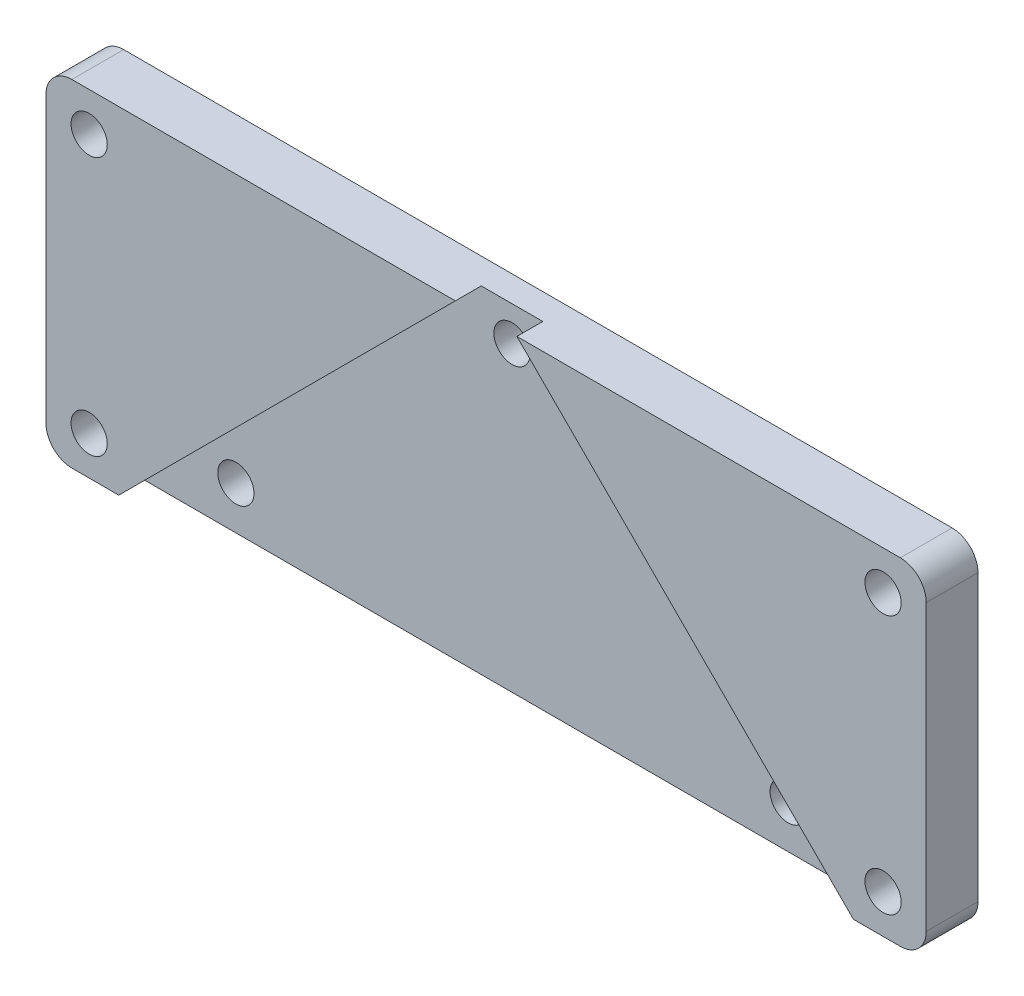
ISO-10303-21;
HEADER;
FILE_DESCRIPTION(('STEP AP214'),'2;1');
FILE_NAME('part.step','',(''),(''),'','','');
FILE_SCHEMA(('AUTOMOTIVE_DESIGN { 1 0 10303 214 1 1 1 1 }'));
ENDSEC;
DATA;
#1=APPLICATION_CONTEXT('core data for automotive mechanical design processes');
#2=APPLICATION_PROTOCOL_DEFINITION('international standard','automotive_design',2000,#1);
#3=PRODUCT_CONTEXT('',#1,'mechanical');
#4=PRODUCT('Part','Part','',(#3));
#5=PRODUCT_RELATED_PRODUCT_CATEGORY('part','',(#4));
#6=PRODUCT_DEFINITION_FORMATION('','',#4);
#7=PRODUCT_DEFINITION_CONTEXT('part definition',#1,'design');
#8=PRODUCT_DEFINITION('design','',#6,#7);
#9=PRODUCT_DEFINITION_SHAPE('','',#8);
#10=(LENGTH_UNIT() NAMED_UNIT(*) SI_UNIT(.MILLI.,.METRE.));
#11=(NAMED_UNIT(*) PLANE_ANGLE_UNIT() SI_UNIT($,.RADIAN.));
#12=(NAMED_UNIT(*) SI_UNIT($,.STERADIAN.) SOLID_ANGLE_UNIT());
#13=UNCERTAINTY_MEASURE_WITH_UNIT(LENGTH_MEASURE(1.E-05),#10,'distance_accuracy_value','');
#14=(GEOMETRIC_REPRESENTATION_CONTEXT(3) GLOBAL_UNCERTAINTY_ASSIGNED_CONTEXT((#13)) GLOBAL_UNIT_ASSIGNED_CONTEXT((#10,
#11,#12)) REPRESENTATION_CONTEXT('',''));
#15=CARTESIAN_POINT('',(0.,0.,0.));
#16=DIRECTION('',(0.,0.,1.));
#17=DIRECTION('',(1.,0.,0.));
#18=AXIS2_PLACEMENT_3D('',#15,#16,#17);
#19=CARTESIAN_POINT('',(0.,0.,6.));
#20=DIRECTION('',(0.,0.,1.));
#21=DIRECTION('',(1.,0.,0.));
#22=AXIS2_PLACEMENT_3D('',#19,#20,#21);
#23=PLANE('',#22);
#24=CARTESIAN_POINT('',(46.,29.5,6.));
#25=DIRECTION('',(0.,0.,1.));
#26=DIRECTION('',(1.,0.,0.));
#27=AXIS2_PLACEMENT_3D('',#24,#25,#26);
#28=CIRCLE('',#27,2.10000000000001);
#29=CARTESIAN_POINT('',(48.1,29.5,6.));
#30=VERTEX_POINT('',#29);
#31=EDGE_CURVE('E183',#30,#30,#28,.T.);
#32=ORIENTED_EDGE('',*,*,#31,.F.);
#33=EDGE_LOOP('',(#32));
#34=FACE_BOUND('',#33,.T.);
#35=CARTESIAN_POINT('',(46.,-0.500000000000003,6.));
#36=DIRECTION('',(0.,0.,1.));
#37=DIRECTION('',(1.,0.,0.));
#38=AXIS2_PLACEMENT_3D('',#35,#36,#37);
#39=CIRCLE('',#38,2.1);
#40=CARTESIAN_POINT('',(48.1,-0.500000000000003,6.));
#41=VERTEX_POINT('',#40);
#42=EDGE_CURVE('E159',#41,#41,#39,.T.);
#43=ORIENTED_EDGE('',*,*,#42,.F.);
#44=EDGE_LOOP('',(#43));
#45=FACE_BOUND('',#44,.T.);
#46=DIRECTION('',(0.,1.,0.));
#47=VECTOR('',#46,1.);
#48=CARTESIAN_POINT('',(51.,-5.,6.));
#49=LINE('',#48,#47);
#50=CARTESIAN_POINT('',(51.,-1.99999999999999,6.));
#51=VERTEX_POINT('',#50);
#52=CARTESIAN_POINT('',(51.,31.,6.));
#53=VERTEX_POINT('',#52);
#54=EDGE_CURVE('E192',#51,#53,#49,.T.);
#55=ORIENTED_EDGE('',*,*,#54,.T.);
#56=CARTESIAN_POINT('',(48.,31.,6.00000000000001));
#57=DIRECTION('',(0.,0.,1.));
#58=DIRECTION('',(1.,0.,0.));
#59=AXIS2_PLACEMENT_3D('',#56,#57,#58);
#60=CIRCLE('',#59,3.);
#61=CARTESIAN_POINT('',(48.,34.,6.));
#62=VERTEX_POINT('',#61);
#63=EDGE_CURVE('E12',#53,#62,#60,.T.);
#64=ORIENTED_EDGE('',*,*,#63,.T.);
#65=DIRECTION('',(-1.,0.,0.));
#66=VECTOR('',#65,1.);
#67=CARTESIAN_POINT('',(-3.42499999999999,34.,6.));
#68=LINE('',#67,#66);
#69=CARTESIAN_POINT('',(3.56642135623733,34.,6.));
#70=VERTEX_POINT('',#69);
#71=EDGE_CURVE('E209',#62,#70,#68,.T.);
#72=ORIENTED_EDGE('',*,*,#71,.T.);
#73=DIRECTION('',(0.707106781186565,-0.70710678118653,0.));
#74=VECTOR('',#73,1.);
#75=CARTESIAN_POINT('',(18.7832106781176,18.7832106781185,6.));
#76=LINE('',#75,#74);
#77=CARTESIAN_POINT('',(42.5664213562373,-4.99999999999999,6.));
#78=VERTEX_POINT('',#77);
#79=EDGE_CURVE('E286',#70,#78,#76,.T.);
#80=ORIENTED_EDGE('',*,*,#79,.T.);
#81=DIRECTION('',(1.,0.,0.));
#82=VECTOR('',#81,1.);
#83=CARTESIAN_POINT('',(-42.425,-5.,6.));
#84=LINE('',#83,#82);
#85=CARTESIAN_POINT('',(48.,-4.99999999999999,6.));
#86=VERTEX_POINT('',#85);
#87=EDGE_CURVE('E208',#78,#86,#84,.T.);
#88=ORIENTED_EDGE('',*,*,#87,.T.);
#89=CARTESIAN_POINT('',(48.,-1.99999999999999,6.));
#90=DIRECTION('',(0.,0.,1.));
#91=DIRECTION('',(1.,0.,0.));
#92=AXIS2_PLACEMENT_3D('',#89,#90,#91);
#93=CIRCLE('',#92,3.);
#94=EDGE_CURVE('E45',#86,#51,#93,.T.);
#95=ORIENTED_EDGE('',*,*,#94,.T.);
#96=EDGE_LOOP('',(#55,#64,#72,#80,#88,#95));
#97=FACE_BOUND('',#96,.T.);
#98=ADVANCED_FACE('F37',(#34,#45,#97),#23,.T.);
#99=CARTESIAN_POINT('',(-42.425,-5.,6.));
#100=DIRECTION('',(0.,1.,0.));
#101=DIRECTION('',(-1.,0.,0.));
#102=AXIS2_PLACEMENT_3D('',#99,#100,#101);
#103=PLANE('',#102);
#104=CARTESIAN_POINT('',(-48.,-5.,6.));
#105=VERTEX_POINT('',#104);
#106=CARTESIAN_POINT('',(-42.5664213562373,-5.,6.));
#107=VERTEX_POINT('',#106);
#108=EDGE_CURVE('E205',#105,#107,#84,.T.);
#109=ORIENTED_EDGE('',*,*,#108,.F.);
#110=DIRECTION('',(0.,0.,1.));
#111=VECTOR('',#110,1.);
#112=CARTESIAN_POINT('',(-48.,-5.,0.));
#113=LINE('',#112,#111);
#114=CARTESIAN_POINT('',(-48.,-5.,0.));
#115=VERTEX_POINT('',#114);
#116=EDGE_CURVE('E241',#105,#115,#113,.F.);
#117=ORIENTED_EDGE('',*,*,#116,.T.);
#118=DIRECTION('',(1.,0.,0.));
#119=VECTOR('',#118,1.);
#120=CARTESIAN_POINT('',(-42.425,-5.,0.));
#121=LINE('',#120,#119);
#122=CARTESIAN_POINT('',(48.,-4.99999999999999,0.));
#123=VERTEX_POINT('',#122);
#124=EDGE_CURVE('E204',#115,#123,#121,.T.);
#125=ORIENTED_EDGE('',*,*,#124,.T.);
#126=DIRECTION('',(0.,0.,1.));
#127=VECTOR('',#126,1.);
#128=CARTESIAN_POINT('',(48.,-4.99999999999999,6.));
#129=LINE('',#128,#127);
#130=EDGE_CURVE('E238',#123,#86,#129,.T.);
#131=ORIENTED_EDGE('',*,*,#130,.T.);
#132=ORIENTED_EDGE('',*,*,#87,.F.);
#133=DIRECTION('',(0.,0.,1.));
#134=VECTOR('',#133,1.);
#135=CARTESIAN_POINT('',(42.5664213562373,-4.99999999999999,-93.6408079221177));
#136=LINE('',#135,#134);
#137=CARTESIAN_POINT('',(42.5664213562373,-4.99999999999999,3.));
#138=VERTEX_POINT('',#137);
#139=EDGE_CURVE('E146',#138,#78,#136,.T.);
#140=ORIENTED_EDGE('',*,*,#139,.F.);
#141=DIRECTION('',(-1.,0.,0.));
#142=VECTOR('',#141,1.);
#143=CARTESIAN_POINT('',(0.,-4.99999999999999,3.));
#144=LINE('',#143,#142);
#145=CARTESIAN_POINT('',(-42.5664213562373,-5.,3.));
#146=VERTEX_POINT('',#145);
#147=EDGE_CURVE('E130',#138,#146,#144,.T.);
#148=ORIENTED_EDGE('',*,*,#147,.T.);
#149=DIRECTION('',(0.,0.,1.));
#150=VECTOR('',#149,1.);
#151=CARTESIAN_POINT('',(-42.5664213562373,-5.,-93.6408079221177));
#152=LINE('',#151,#150);
#153=EDGE_CURVE('E139',#146,#107,#152,.T.);
#154=ORIENTED_EDGE('',*,*,#153,.T.);
#155=EDGE_LOOP('',(#109,#117,#125,#131,#132,#140,#148,#154));
#156=FACE_BOUND('',#155,.T.);
#157=ADVANCED_FACE('F148',(#156),#103,.F.);
#158=CARTESIAN_POINT('',(-3.42499999999999,34.,6.));
#159=DIRECTION('',(0.,-1.,0.));
#160=DIRECTION('',(0.,0.,-1.));
#161=AXIS2_PLACEMENT_3D('',#158,#159,#160);
#162=PLANE('',#161);
#163=DIRECTION('',(-1.,0.,0.));
#164=VECTOR('',#163,1.);
#165=CARTESIAN_POINT('',(-3.42499999999999,34.,0.));
#166=LINE('',#165,#164);
#167=CARTESIAN_POINT('',(48.,34.,0.));
#168=VERTEX_POINT('',#167);
#169=CARTESIAN_POINT('',(-48.,34.,0.));
#170=VERTEX_POINT('',#169);
#171=EDGE_CURVE('E214',#168,#170,#166,.T.);
#172=ORIENTED_EDGE('',*,*,#171,.T.);
#173=DIRECTION('',(0.,0.,1.));
#174=VECTOR('',#173,1.);
#175=CARTESIAN_POINT('',(-48.,34.,6.));
#176=LINE('',#175,#174);
#177=CARTESIAN_POINT('',(-48.,34.,6.));
#178=VERTEX_POINT('',#177);
#179=EDGE_CURVE('E218',#170,#178,#176,.T.);
#180=ORIENTED_EDGE('',*,*,#179,.T.);
#181=CARTESIAN_POINT('',(-3.5664213562373,34.,6.));
#182=VERTEX_POINT('',#181);
#183=EDGE_CURVE('E207',#182,#178,#68,.T.);
#184=ORIENTED_EDGE('',*,*,#183,.F.);
#185=DIRECTION('',(0.,0.,1.));
#186=VECTOR('',#185,1.);
#187=CARTESIAN_POINT('',(-3.5664213562373,34.,-93.6408079221177));
#188=LINE('',#187,#186);
#189=CARTESIAN_POINT('',(-3.5664213562373,34.,3.));
#190=VERTEX_POINT('',#189);
#191=EDGE_CURVE('E145',#190,#182,#188,.T.);
#192=ORIENTED_EDGE('',*,*,#191,.F.);
#193=DIRECTION('',(1.,0.,0.));
#194=VECTOR('',#193,1.);
#195=CARTESIAN_POINT('',(0.,34.,3.));
#196=LINE('',#195,#194);
#197=CARTESIAN_POINT('',(3.56642135623732,34.,3.));
#198=VERTEX_POINT('',#197);
#199=EDGE_CURVE('E133',#190,#198,#196,.T.);
#200=ORIENTED_EDGE('',*,*,#199,.T.);
#201=DIRECTION('',(0.,0.,1.));
#202=VECTOR('',#201,1.);
#203=CARTESIAN_POINT('',(3.56642135623733,34.,-93.6408079221177));
#204=LINE('',#203,#202);
#205=EDGE_CURVE('E258',#198,#70,#204,.T.);
#206=ORIENTED_EDGE('',*,*,#205,.T.);
#207=ORIENTED_EDGE('',*,*,#71,.F.);
#208=DIRECTION('',(0.,0.,1.));
#209=VECTOR('',#208,1.);
#210=CARTESIAN_POINT('',(48.,34.,0.));
#211=LINE('',#210,#209);
#212=EDGE_CURVE('E211',#62,#168,#211,.F.);
#213=ORIENTED_EDGE('',*,*,#212,.T.);
#214=EDGE_LOOP('',(#172,#180,#184,#192,#200,#206,#207,#213));
#215=FACE_BOUND('',#214,.T.);
#216=ADVANCED_FACE('F256',(#215),#162,.F.);
#217=CARTESIAN_POINT('',(0.,30.,6.));
#218=DIRECTION('',(0.,0.,-1.));
#219=DIRECTION('',(-1.,0.,0.));
#220=AXIS2_PLACEMENT_3D('',#217,#218,#219);
#221=CYLINDRICAL_SURFACE('',#220,2.1);
#222=CARTESIAN_POINT('',(0.,30.,0.));
#223=DIRECTION('',(0.,0.,1.));
#224=DIRECTION('',(1.,0.,0.));
#225=AXIS2_PLACEMENT_3D('',#222,#223,#224);
#226=CIRCLE('',#225,2.1);
#227=CARTESIAN_POINT('',(2.1,30.,0.));
#228=VERTEX_POINT('',#227);
#229=EDGE_CURVE('E201',#228,#228,#226,.T.);
#230=ORIENTED_EDGE('',*,*,#229,.F.);
#231=EDGE_LOOP('',(#230));
#232=FACE_BOUND('',#231,.T.);
#233=CARTESIAN_POINT('',(0.,30.,3.));
#234=DIRECTION('',(0.,0.,1.));
#235=DIRECTION('',(1.,0.,0.));
#236=AXIS2_PLACEMENT_3D('',#233,#234,#235);
#237=CIRCLE('',#236,2.1);
#238=CARTESIAN_POINT('',(2.1,30.,3.));
#239=VERTEX_POINT('',#238);
#240=EDGE_CURVE('E294',#239,#239,#237,.T.);
#241=ORIENTED_EDGE('',*,*,#240,.T.);
#242=EDGE_LOOP('',(#241));
#243=FACE_BOUND('',#242,.T.);
#244=ADVANCED_FACE('F316',(#232,#243),#221,.F.);
#245=CARTESIAN_POINT('',(-32.,0.,6.));
#246=DIRECTION('',(0.,0.,-1.));
#247=DIRECTION('',(-1.,0.,0.));
#248=AXIS2_PLACEMENT_3D('',#245,#246,#247);
#249=CYLINDRICAL_SURFACE('',#248,2.1);
#250=CARTESIAN_POINT('',(-32.,0.,0.));
#251=DIRECTION('',(0.,0.,1.));
#252=DIRECTION('',(1.,0.,0.));
#253=AXIS2_PLACEMENT_3D('',#250,#251,#252);
#254=CIRCLE('',#253,2.1);
#255=CARTESIAN_POINT('',(-29.9,0.,0.));
#256=VERTEX_POINT('',#255);
#257=EDGE_CURVE('E198',#256,#256,#254,.T.);
#258=ORIENTED_EDGE('',*,*,#257,.F.);
#259=EDGE_LOOP('',(#258));
#260=FACE_BOUND('',#259,.T.);
#261=CARTESIAN_POINT('',(-32.,0.,3.));
#262=DIRECTION('',(0.,0.,1.));
#263=DIRECTION('',(1.,0.,0.));
#264=AXIS2_PLACEMENT_3D('',#261,#262,#263);
#265=CIRCLE('',#264,2.1);
#266=CARTESIAN_POINT('',(-29.9,0.,3.));
#267=VERTEX_POINT('',#266);
#268=EDGE_CURVE('E153',#267,#267,#265,.T.);
#269=ORIENTED_EDGE('',*,*,#268,.T.);
#270=EDGE_LOOP('',(#269));
#271=FACE_BOUND('',#270,.T.);
#272=ADVANCED_FACE('F299',(#260,#271),#249,.F.);
#273=CARTESIAN_POINT('',(32.,0.,6.));
#274=DIRECTION('',(0.,0.,-1.));
#275=DIRECTION('',(-1.,0.,0.));
#276=AXIS2_PLACEMENT_3D('',#273,#274,#275);
#277=CYLINDRICAL_SURFACE('',#276,2.1);
#278=CARTESIAN_POINT('',(32.,0.,0.));
#279=DIRECTION('',(0.,0.,1.));
#280=DIRECTION('',(1.,0.,0.));
#281=AXIS2_PLACEMENT_3D('',#278,#279,#280);
#282=CIRCLE('',#281,2.1);
#283=CARTESIAN_POINT('',(34.1,0.,0.));
#284=VERTEX_POINT('',#283);
#285=EDGE_CURVE('E174',#284,#284,#282,.T.);
#286=ORIENTED_EDGE('',*,*,#285,.F.);
#287=EDGE_LOOP('',(#286));
#288=FACE_BOUND('',#287,.T.);
#289=CARTESIAN_POINT('',(32.,0.,3.));
#290=DIRECTION('',(0.,0.,1.));
#291=DIRECTION('',(1.,0.,0.));
#292=AXIS2_PLACEMENT_3D('',#289,#290,#291);
#293=CIRCLE('',#292,2.1);
#294=CARTESIAN_POINT('',(34.1,0.,3.));
#295=VERTEX_POINT('',#294);
#296=EDGE_CURVE('E150',#295,#295,#293,.T.);
#297=ORIENTED_EDGE('',*,*,#296,.T.);
#298=EDGE_LOOP('',(#297));
#299=FACE_BOUND('',#298,.T.);
#300=ADVANCED_FACE('F307',(#288,#299),#277,.F.);
#301=ORIENTED_EDGE('',*,*,#183,.T.);
#302=CARTESIAN_POINT('',(-48.,31.,6.));
#303=DIRECTION('',(0.,0.,1.));
#304=DIRECTION('',(1.,0.,0.));
#305=AXIS2_PLACEMENT_3D('',#302,#303,#304);
#306=CIRCLE('',#305,3.);
#307=CARTESIAN_POINT('',(-51.,31.,6.));
#308=VERTEX_POINT('',#307);
#309=EDGE_CURVE('E223',#178,#308,#306,.T.);
#310=ORIENTED_EDGE('',*,*,#309,.T.);
#311=DIRECTION('',(0.,-1.,0.));
#312=VECTOR('',#311,1.);
#313=CARTESIAN_POINT('',(-51.,-5.,6.));
#314=LINE('',#313,#312);
#315=CARTESIAN_POINT('',(-51.,-2.,6.));
#316=VERTEX_POINT('',#315);
#317=EDGE_CURVE('E178',#308,#316,#314,.T.);
#318=ORIENTED_EDGE('',*,*,#317,.T.);
#319=CARTESIAN_POINT('',(-48.,-2.,6.00000000000001));
#320=DIRECTION('',(0.,0.,1.));
#321=DIRECTION('',(1.,0.,0.));
#322=AXIS2_PLACEMENT_3D('',#319,#320,#321);
#323=CIRCLE('',#322,3.);
#324=EDGE_CURVE('E221',#316,#105,#323,.T.);
#325=ORIENTED_EDGE('',*,*,#324,.T.);
#326=ORIENTED_EDGE('',*,*,#108,.T.);
#327=DIRECTION('',(-0.707106781186547,-0.707106781186548,0.));
#328=VECTOR('',#327,1.);
#329=CARTESIAN_POINT('',(-18.7832106781187,18.7832106781186,6.));
#330=LINE('',#329,#328);
#331=EDGE_CURVE('E142',#182,#107,#330,.T.);
#332=ORIENTED_EDGE('',*,*,#331,.F.);
#333=EDGE_LOOP('',(#301,#310,#318,#325,#326,#332));
#334=FACE_BOUND('',#333,.T.);
#335=CARTESIAN_POINT('',(-46.,-0.500000000000003,6.));
#336=DIRECTION('',(0.,0.,1.));
#337=DIRECTION('',(1.,0.,0.));
#338=AXIS2_PLACEMENT_3D('',#335,#336,#337);
#339=CIRCLE('',#338,2.1);
#340=CARTESIAN_POINT('',(-43.9,-0.500000000000003,6.));
#341=VERTEX_POINT('',#340);
#342=EDGE_CURVE('E189',#341,#341,#339,.T.);
#343=ORIENTED_EDGE('',*,*,#342,.F.);
#344=EDGE_LOOP('',(#343));
#345=FACE_BOUND('',#344,.T.);
#346=CARTESIAN_POINT('',(-46.,29.5,6.));
#347=DIRECTION('',(0.,0.,1.));
#348=DIRECTION('',(1.,0.,0.));
#349=AXIS2_PLACEMENT_3D('',#346,#347,#348);
#350=CIRCLE('',#349,2.1);
#351=CARTESIAN_POINT('',(-43.9,29.5,6.));
#352=VERTEX_POINT('',#351);
#353=EDGE_CURVE('E186',#352,#352,#350,.T.);
#354=ORIENTED_EDGE('',*,*,#353,.F.);
#355=EDGE_LOOP('',(#354));
#356=FACE_BOUND('',#355,.T.);
#357=ADVANCED_FACE('F273',(#334,#345,#356),#23,.T.);
#358=CARTESIAN_POINT('',(0.,0.,0.));
#359=DIRECTION('',(0.,0.,1.));
#360=DIRECTION('',(1.,0.,0.));
#361=AXIS2_PLACEMENT_3D('',#358,#359,#360);
#362=PLANE('',#361);
#363=DIRECTION('',(0.,1.,0.));
#364=VECTOR('',#363,1.);
#365=CARTESIAN_POINT('',(-51.,-5.,0.));
#366=LINE('',#365,#364);
#367=CARTESIAN_POINT('',(-51.,-2.,0.));
#368=VERTEX_POINT('',#367);
#369=CARTESIAN_POINT('',(-51.,31.,0.));
#370=VERTEX_POINT('',#369);
#371=EDGE_CURVE('E175',#368,#370,#366,.T.);
#372=ORIENTED_EDGE('',*,*,#371,.T.);
#373=CARTESIAN_POINT('',(-48.,31.,0.));
#374=DIRECTION('',(0.,0.,1.));
#375=DIRECTION('',(1.,0.,0.));
#376=AXIS2_PLACEMENT_3D('',#373,#374,#375);
#377=CIRCLE('',#376,3.);
#378=EDGE_CURVE('E236',#370,#170,#377,.F.);
#379=ORIENTED_EDGE('',*,*,#378,.T.);
#380=ORIENTED_EDGE('',*,*,#171,.F.);
#381=CARTESIAN_POINT('',(48.,31.,0.));
#382=DIRECTION('',(0.,0.,1.));
#383=DIRECTION('',(1.,0.,0.));
#384=AXIS2_PLACEMENT_3D('',#381,#382,#383);
#385=CIRCLE('',#384,3.);
#386=CARTESIAN_POINT('',(51.,31.,0.));
#387=VERTEX_POINT('',#386);
#388=EDGE_CURVE('E232',#168,#387,#385,.F.);
#389=ORIENTED_EDGE('',*,*,#388,.T.);
#390=DIRECTION('',(0.,-1.,0.));
#391=VECTOR('',#390,1.);
#392=CARTESIAN_POINT('',(51.,-5.,0.));
#393=LINE('',#392,#391);
#394=CARTESIAN_POINT('',(51.,-1.99999999999999,0.));
#395=VERTEX_POINT('',#394);
#396=EDGE_CURVE('E171',#387,#395,#393,.T.);
#397=ORIENTED_EDGE('',*,*,#396,.T.);
#398=CARTESIAN_POINT('',(48.,-1.99999999999999,0.));
#399=DIRECTION('',(0.,0.,1.));
#400=DIRECTION('',(1.,0.,0.));
#401=AXIS2_PLACEMENT_3D('',#398,#399,#400);
#402=CIRCLE('',#401,3.);
#403=EDGE_CURVE('E230',#395,#123,#402,.F.);
#404=ORIENTED_EDGE('',*,*,#403,.T.);
#405=ORIENTED_EDGE('',*,*,#124,.F.);
#406=CARTESIAN_POINT('',(-48.,-2.,0.));
#407=DIRECTION('',(0.,0.,1.));
#408=DIRECTION('',(1.,0.,0.));
#409=AXIS2_PLACEMENT_3D('',#406,#407,#408);
#410=CIRCLE('',#409,3.);
#411=EDGE_CURVE('E234',#115,#368,#410,.F.);
#412=ORIENTED_EDGE('',*,*,#411,.T.);
#413=EDGE_LOOP('',(#372,#379,#380,#389,#397,#404,#405,#412));
#414=FACE_BOUND('',#413,.T.);
#415=ORIENTED_EDGE('',*,*,#229,.T.);
#416=EDGE_LOOP('',(#415));
#417=FACE_BOUND('',#416,.T.);
#418=ORIENTED_EDGE('',*,*,#257,.T.);
#419=EDGE_LOOP('',(#418));
#420=FACE_BOUND('',#419,.T.);
#421=ORIENTED_EDGE('',*,*,#285,.T.);
#422=EDGE_LOOP('',(#421));
#423=FACE_BOUND('',#422,.T.);
#424=CARTESIAN_POINT('',(46.,29.5,0.));
#425=DIRECTION('',(0.,0.,1.));
#426=DIRECTION('',(1.,0.,0.));
#427=AXIS2_PLACEMENT_3D('',#424,#425,#426);
#428=CIRCLE('',#427,2.10000000000001);
#429=CARTESIAN_POINT('',(48.1,29.5,0.));
#430=VERTEX_POINT('',#429);
#431=EDGE_CURVE('E164',#430,#430,#428,.F.);
#432=ORIENTED_EDGE('',*,*,#431,.F.);
#433=EDGE_LOOP('',(#432));
#434=FACE_BOUND('',#433,.T.);
#435=CARTESIAN_POINT('',(46.,-0.500000000000003,0.));
#436=DIRECTION('',(0.,0.,1.));
#437=DIRECTION('',(1.,0.,0.));
#438=AXIS2_PLACEMENT_3D('',#435,#436,#437);
#439=CIRCLE('',#438,2.1);
#440=CARTESIAN_POINT('',(48.1,-0.500000000000003,0.));
#441=VERTEX_POINT('',#440);
#442=EDGE_CURVE('E161',#441,#441,#439,.F.);
#443=ORIENTED_EDGE('',*,*,#442,.F.);
#444=EDGE_LOOP('',(#443));
#445=FACE_BOUND('',#444,.T.);
#446=CARTESIAN_POINT('',(-46.,-0.500000000000003,0.));
#447=DIRECTION('',(0.,0.,1.));
#448=DIRECTION('',(1.,0.,0.));
#449=AXIS2_PLACEMENT_3D('',#446,#447,#448);
#450=CIRCLE('',#449,2.1);
#451=CARTESIAN_POINT('',(-43.9,-0.500000000000003,0.));
#452=VERTEX_POINT('',#451);
#453=EDGE_CURVE('E168',#452,#452,#450,.F.);
#454=ORIENTED_EDGE('',*,*,#453,.F.);
#455=EDGE_LOOP('',(#454));
#456=FACE_BOUND('',#455,.T.);
#457=CARTESIAN_POINT('',(-46.,29.5,0.));
#458=DIRECTION('',(0.,0.,1.));
#459=DIRECTION('',(1.,0.,0.));
#460=AXIS2_PLACEMENT_3D('',#457,#458,#459);
#461=CIRCLE('',#460,2.1);
#462=CARTESIAN_POINT('',(-43.9,29.5,0.));
#463=VERTEX_POINT('',#462);
#464=EDGE_CURVE('E165',#463,#463,#461,.F.);
#465=ORIENTED_EDGE('',*,*,#464,.F.);
#466=EDGE_LOOP('',(#465));
#467=FACE_BOUND('',#466,.T.);
#468=ADVANCED_FACE('F261',(#414,#417,#420,#423,#434,#445,#456,#467),#362,.F.);
#469=CARTESIAN_POINT('',(51.,-5.,-109.201648339208));
#470=DIRECTION('',(1.,0.,0.));
#471=DIRECTION('',(0.,1.,0.));
#472=AXIS2_PLACEMENT_3D('',#469,#470,#471);
#473=PLANE('',#472);
#474=ORIENTED_EDGE('',*,*,#396,.F.);
#475=DIRECTION('',(0.,0.,1.));
#476=VECTOR('',#475,1.);
#477=CARTESIAN_POINT('',(51.,31.,6.00000000000001));
#478=LINE('',#477,#476);
#479=EDGE_CURVE('E245',#387,#53,#478,.T.);
#480=ORIENTED_EDGE('',*,*,#479,.T.);
#481=ORIENTED_EDGE('',*,*,#54,.F.);
#482=DIRECTION('',(0.,0.,1.));
#483=VECTOR('',#482,1.);
#484=CARTESIAN_POINT('',(51.,-1.99999999999999,0.));
#485=LINE('',#484,#483);
#486=EDGE_CURVE('E243',#51,#395,#485,.F.);
#487=ORIENTED_EDGE('',*,*,#486,.T.);
#488=EDGE_LOOP('',(#474,#480,#481,#487));
#489=FACE_BOUND('',#488,.T.);
#490=ADVANCED_FACE('F248',(#489),#473,.T.);
#491=CARTESIAN_POINT('',(46.,-0.500000000000003,-109.201648339208));
#492=DIRECTION('',(0.,0.,1.));
#493=DIRECTION('',(1.,0.,0.));
#494=AXIS2_PLACEMENT_3D('',#491,#492,#493);
#495=CYLINDRICAL_SURFACE('',#494,2.1);
#496=ORIENTED_EDGE('',*,*,#442,.T.);
#497=EDGE_LOOP('',(#496));
#498=FACE_BOUND('',#497,.T.);
#499=ORIENTED_EDGE('',*,*,#42,.T.);
#500=EDGE_LOOP('',(#499));
#501=FACE_BOUND('',#500,.T.);
#502=ADVANCED_FACE('F384',(#498,#501),#495,.F.);
#503=CARTESIAN_POINT('',(46.,29.5,-109.201648339208));
#504=DIRECTION('',(0.,0.,1.));
#505=DIRECTION('',(1.,0.,0.));
#506=AXIS2_PLACEMENT_3D('',#503,#504,#505);
#507=CYLINDRICAL_SURFACE('',#506,2.10000000000001);
#508=ORIENTED_EDGE('',*,*,#431,.T.);
#509=EDGE_LOOP('',(#508));
#510=FACE_BOUND('',#509,.T.);
#511=ORIENTED_EDGE('',*,*,#31,.T.);
#512=EDGE_LOOP('',(#511));
#513=FACE_BOUND('',#512,.T.);
#514=ADVANCED_FACE('F371',(#510,#513),#507,.F.);
#515=CARTESIAN_POINT('',(-51.,-5.,-109.201648339208));
#516=DIRECTION('',(-1.,0.,0.));
#517=DIRECTION('',(0.,-1.,0.));
#518=AXIS2_PLACEMENT_3D('',#515,#516,#517);
#519=PLANE('',#518);
#520=ORIENTED_EDGE('',*,*,#317,.F.);
#521=DIRECTION('',(0.,0.,1.));
#522=VECTOR('',#521,1.);
#523=CARTESIAN_POINT('',(-51.,31.,0.));
#524=LINE('',#523,#522);
#525=EDGE_CURVE('E228',#308,#370,#524,.F.);
#526=ORIENTED_EDGE('',*,*,#525,.T.);
#527=ORIENTED_EDGE('',*,*,#371,.F.);
#528=DIRECTION('',(0.,0.,1.));
#529=VECTOR('',#528,1.);
#530=CARTESIAN_POINT('',(-51.,-2.,6.00000000000001));
#531=LINE('',#530,#529);
#532=EDGE_CURVE('E225',#368,#316,#531,.T.);
#533=ORIENTED_EDGE('',*,*,#532,.T.);
#534=EDGE_LOOP('',(#520,#526,#527,#533));
#535=FACE_BOUND('',#534,.T.);
#536=ADVANCED_FACE('F276',(#535),#519,.T.);
#537=CARTESIAN_POINT('',(-46.,-0.500000000000003,-109.201648339208));
#538=DIRECTION('',(0.,0.,1.));
#539=DIRECTION('',(1.,0.,0.));
#540=AXIS2_PLACEMENT_3D('',#537,#538,#539);
#541=CYLINDRICAL_SURFACE('',#540,2.1);
#542=ORIENTED_EDGE('',*,*,#453,.T.);
#543=EDGE_LOOP('',(#542));
#544=FACE_BOUND('',#543,.T.);
#545=ORIENTED_EDGE('',*,*,#342,.T.);
#546=EDGE_LOOP('',(#545));
#547=FACE_BOUND('',#546,.T.);
#548=ADVANCED_FACE('F370',(#544,#547),#541,.F.);
#549=CARTESIAN_POINT('',(-46.,29.5,-109.201648339208));
#550=DIRECTION('',(0.,0.,1.));
#551=DIRECTION('',(1.,0.,0.));
#552=AXIS2_PLACEMENT_3D('',#549,#550,#551);
#553=CYLINDRICAL_SURFACE('',#552,2.1);
#554=ORIENTED_EDGE('',*,*,#464,.T.);
#555=EDGE_LOOP('',(#554));
#556=FACE_BOUND('',#555,.T.);
#557=ORIENTED_EDGE('',*,*,#353,.T.);
#558=EDGE_LOOP('',(#557));
#559=FACE_BOUND('',#558,.T.);
#560=ADVANCED_FACE('F445',(#556,#559),#553,.F.);
#561=CARTESIAN_POINT('',(18.7832106781176,18.7832106781185,-93.6408079221177));
#562=DIRECTION('',(-0.70710678118653,-0.707106781186565,0.));
#563=DIRECTION('',(0.707106781186565,-0.70710678118653,0.));
#564=AXIS2_PLACEMENT_3D('',#561,#562,#563);
#565=PLANE('',#564);
#566=ORIENTED_EDGE('',*,*,#139,.T.);
#567=ORIENTED_EDGE('',*,*,#79,.F.);
#568=ORIENTED_EDGE('',*,*,#205,.F.);
#569=DIRECTION('',(-0.707106781186565,0.70710678118653,0.));
#570=VECTOR('',#569,1.);
#571=CARTESIAN_POINT('',(18.7832106781176,18.7832106781185,3.));
#572=LINE('',#571,#570);
#573=EDGE_CURVE('E156',#138,#198,#572,.T.);
#574=ORIENTED_EDGE('',*,*,#573,.F.);
#575=EDGE_LOOP('',(#566,#567,#568,#574));
#576=FACE_BOUND('',#575,.T.);
#577=ADVANCED_FACE('F436',(#576),#565,.T.);
#578=CARTESIAN_POINT('',(-18.7832106781187,18.7832106781186,-93.6408079221177));
#579=DIRECTION('',(-0.707106781186548,0.707106781186547,0.));
#580=DIRECTION('',(-0.707106781186547,-0.707106781186548,0.));
#581=AXIS2_PLACEMENT_3D('',#578,#579,#580);
#582=PLANE('',#581);
#583=DIRECTION('',(0.707106781186547,0.707106781186548,0.));
#584=VECTOR('',#583,1.);
#585=CARTESIAN_POINT('',(-18.7832106781187,18.7832106781186,3.));
#586=LINE('',#585,#584);
#587=EDGE_CURVE('E125',#146,#190,#586,.T.);
#588=ORIENTED_EDGE('',*,*,#587,.T.);
#589=ORIENTED_EDGE('',*,*,#191,.T.);
#590=ORIENTED_EDGE('',*,*,#331,.T.);
#591=ORIENTED_EDGE('',*,*,#153,.F.);
#592=EDGE_LOOP('',(#588,#589,#590,#591));
#593=FACE_BOUND('',#592,.T.);
#594=ADVANCED_FACE('F140',(#593),#582,.F.);
#595=CARTESIAN_POINT('',(0.,0.,3.));
#596=DIRECTION('',(0.,0.,1.));
#597=DIRECTION('',(1.,0.,0.));
#598=AXIS2_PLACEMENT_3D('',#595,#596,#597);
#599=PLANE('',#598);
#600=ORIENTED_EDGE('',*,*,#240,.F.);
#601=EDGE_LOOP('',(#600));
#602=FACE_BOUND('',#601,.T.);
#603=ORIENTED_EDGE('',*,*,#268,.F.);
#604=EDGE_LOOP('',(#603));
#605=FACE_BOUND('',#604,.T.);
#606=ORIENTED_EDGE('',*,*,#296,.F.);
#607=EDGE_LOOP('',(#606));
#608=FACE_BOUND('',#607,.T.);
#609=ORIENTED_EDGE('',*,*,#147,.F.);
#610=ORIENTED_EDGE('',*,*,#573,.T.);
#611=ORIENTED_EDGE('',*,*,#199,.F.);
#612=ORIENTED_EDGE('',*,*,#587,.F.);
#613=EDGE_LOOP('',(#609,#610,#611,#612));
#614=FACE_BOUND('',#613,.T.);
#615=ADVANCED_FACE('F127',(#602,#605,#608,#614),#599,.T.);
#616=CARTESIAN_POINT('',(-48.,31.,6.));
#617=DIRECTION('',(0.,0.,-1.));
#618=DIRECTION('',(-1.,0.,0.));
#619=AXIS2_PLACEMENT_3D('',#616,#617,#618);
#620=CYLINDRICAL_SURFACE('',#619,3.);
#621=ORIENTED_EDGE('',*,*,#378,.F.);
#622=ORIENTED_EDGE('',*,*,#525,.F.);
#623=ORIENTED_EDGE('',*,*,#309,.F.);
#624=ORIENTED_EDGE('',*,*,#179,.F.);
#625=EDGE_LOOP('',(#621,#622,#623,#624));
#626=FACE_BOUND('',#625,.T.);
#627=ADVANCED_FACE('F269',(#626),#620,.T.);
#628=CARTESIAN_POINT('',(-48.,-2.,-109.201648339208));
#629=DIRECTION('',(0.,0.,-1.));
#630=DIRECTION('',(-1.,0.,0.));
#631=AXIS2_PLACEMENT_3D('',#628,#629,#630);
#632=CYLINDRICAL_SURFACE('',#631,3.);
#633=ORIENTED_EDGE('',*,*,#411,.F.);
#634=ORIENTED_EDGE('',*,*,#116,.F.);
#635=ORIENTED_EDGE('',*,*,#324,.F.);
#636=ORIENTED_EDGE('',*,*,#532,.F.);
#637=EDGE_LOOP('',(#633,#634,#635,#636));
#638=FACE_BOUND('',#637,.T.);
#639=ADVANCED_FACE('F281',(#638),#632,.T.);
#640=CARTESIAN_POINT('',(48.,31.,-109.201648339208));
#641=DIRECTION('',(0.,0.,-1.));
#642=DIRECTION('',(-1.,0.,0.));
#643=AXIS2_PLACEMENT_3D('',#640,#641,#642);
#644=CYLINDRICAL_SURFACE('',#643,3.);
#645=ORIENTED_EDGE('',*,*,#388,.F.);
#646=ORIENTED_EDGE('',*,*,#212,.F.);
#647=ORIENTED_EDGE('',*,*,#63,.F.);
#648=ORIENTED_EDGE('',*,*,#479,.F.);
#649=EDGE_LOOP('',(#645,#646,#647,#648));
#650=FACE_BOUND('',#649,.T.);
#651=ADVANCED_FACE('F259',(#650),#644,.T.);
#652=CARTESIAN_POINT('',(48.,-1.99999999999999,6.));
#653=DIRECTION('',(0.,0.,-1.));
#654=DIRECTION('',(-1.,0.,0.));
#655=AXIS2_PLACEMENT_3D('',#652,#653,#654);
#656=CYLINDRICAL_SURFACE('',#655,3.);
#657=ORIENTED_EDGE('',*,*,#403,.F.);
#658=ORIENTED_EDGE('',*,*,#486,.F.);
#659=ORIENTED_EDGE('',*,*,#94,.F.);
#660=ORIENTED_EDGE('',*,*,#130,.F.);
#661=EDGE_LOOP('',(#657,#658,#659,#660));
#662=FACE_BOUND('',#661,.T.);
#663=ADVANCED_FACE('F39',(#662),#656,.T.);
#664=CLOSED_SHELL('',(#98,#157,#216,#244,#272,#300,#357,#468,#490,#502,#514,#536,#548,#560,#577,
#594,#615,#627,#639,#651,#663));
#665=MANIFOLD_SOLID_BREP('B2',#664);
#666=ADVANCED_BREP_SHAPE_REPRESENTATION('',(#18,#665),#14);
#667=SHAPE_DEFINITION_REPRESENTATION(#9,#666);
ENDSEC;
END-ISO-10303-21;
